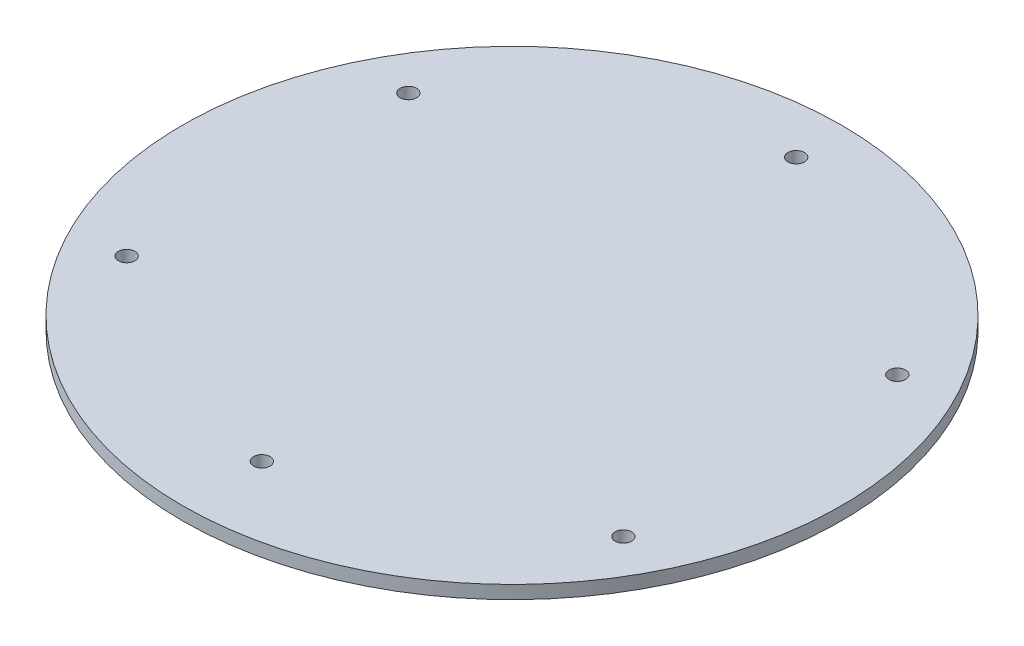
ISO-10303-21;
HEADER;
FILE_DESCRIPTION(('STEP AP214'),'2;1');
FILE_NAME('part.step','',(''),(''),'','','');
FILE_SCHEMA(('AUTOMOTIVE_DESIGN { 1 0 10303 214 1 1 1 1 }'));
ENDSEC;
DATA;
#1=APPLICATION_CONTEXT('core data for automotive mechanical design processes');
#2=APPLICATION_PROTOCOL_DEFINITION('international standard','automotive_design',2000,#1);
#3=PRODUCT_CONTEXT('',#1,'mechanical');
#4=PRODUCT('Part','Part','',(#3));
#5=PRODUCT_RELATED_PRODUCT_CATEGORY('part','',(#4));
#6=PRODUCT_DEFINITION_FORMATION('','',#4);
#7=PRODUCT_DEFINITION_CONTEXT('part definition',#1,'design');
#8=PRODUCT_DEFINITION('design','',#6,#7);
#9=PRODUCT_DEFINITION_SHAPE('','',#8);
#10=(LENGTH_UNIT() NAMED_UNIT(*) SI_UNIT(.MILLI.,.METRE.));
#11=(NAMED_UNIT(*) PLANE_ANGLE_UNIT() SI_UNIT($,.RADIAN.));
#12=(NAMED_UNIT(*) SI_UNIT($,.STERADIAN.) SOLID_ANGLE_UNIT());
#13=UNCERTAINTY_MEASURE_WITH_UNIT(LENGTH_MEASURE(1.E-05),#10,'distance_accuracy_value','');
#14=(GEOMETRIC_REPRESENTATION_CONTEXT(3) GLOBAL_UNCERTAINTY_ASSIGNED_CONTEXT((#13)) GLOBAL_UNIT_ASSIGNED_CONTEXT((#10,
#11,#12)) REPRESENTATION_CONTEXT('',''));
#15=CARTESIAN_POINT('',(0.,0.,0.));
#16=DIRECTION('',(0.,0.,1.));
#17=DIRECTION('',(1.,0.,0.));
#18=AXIS2_PLACEMENT_3D('',#15,#16,#17);
#19=CARTESIAN_POINT('',(1.9537450703172,2.,0.641277234321879));
#20=DIRECTION('',(0.,1.,0.));
#21=DIRECTION('',(0.,0.,1.));
#22=AXIS2_PLACEMENT_3D('',#19,#20,#21);
#23=PLANE('',#22);
#24=CARTESIAN_POINT('',(2.15334480760456,2.,38.7931650621697));
#25=DIRECTION('',(0.,1.,0.));
#26=DIRECTION('',(0.,0.,1.));
#27=AXIS2_PLACEMENT_3D('',#24,#25,#26);
#28=CIRCLE('',#27,1.25);
#29=CARTESIAN_POINT('',(2.15334480760456,2.,40.0431650621697));
#30=VERTEX_POINT('',#29);
#31=EDGE_CURVE('E69',#30,#30,#28,.T.);
#32=ORIENTED_EDGE('',*,*,#31,.F.);
#33=EDGE_LOOP('',(#32));
#34=FACE_BOUND('',#33,.T.);
#35=CARTESIAN_POINT('',(38.9808099361509,2.,-20.7950066515646));
#36=DIRECTION('',(0.,1.,0.));
#37=DIRECTION('',(0.,0.,1.));
#38=AXIS2_PLACEMENT_3D('',#35,#36,#37);
#39=CIRCLE('',#38,1.25);
#40=CARTESIAN_POINT('',(38.9808099361509,2.,-19.5450066515646));
#41=VERTEX_POINT('',#40);
#42=EDGE_CURVE('E57',#41,#41,#39,.T.);
#43=ORIENTED_EDGE('',*,*,#42,.F.);
#44=EDGE_LOOP('',(#43));
#45=FACE_BOUND('',#44,.T.);
#46=CARTESIAN_POINT('',(-35.1241537705123,2.,-20.7069596241211));
#47=DIRECTION('',(0.,1.,0.));
#48=DIRECTION('',(0.,0.,1.));
#49=AXIS2_PLACEMENT_3D('',#46,#47,#48);
#50=CIRCLE('',#49,1.25);
#51=CARTESIAN_POINT('',(-35.1241537705123,2.,-19.4569596241211));
#52=VERTEX_POINT('',#51);
#53=EDGE_CURVE('E46',#52,#52,#50,.T.);
#54=ORIENTED_EDGE('',*,*,#53,.F.);
#55=EDGE_LOOP('',(#54));
#56=FACE_BOUND('',#55,.T.);
#57=CARTESIAN_POINT('',(1.9537450703172,2.,0.641277234321879));
#58=DIRECTION('',(0.,1.,0.));
#59=DIRECTION('',(0.,0.,1.));
#60=AXIS2_PLACEMENT_3D('',#57,#58,#59);
#61=CIRCLE('',#60,50.);
#62=CARTESIAN_POINT('',(1.9537450703172,2.,50.6412772343219));
#63=VERTEX_POINT('',#62);
#64=EDGE_CURVE('E10',#63,#63,#61,.T.);
#65=ORIENTED_EDGE('',*,*,#64,.T.);
#66=EDGE_LOOP('',(#65));
#67=FACE_BOUND('',#66,.T.);
#68=CARTESIAN_POINT('',(2.72948539176649,2.,-41.6945479177622));
#69=DIRECTION('',(0.,1.,0.));
#70=DIRECTION('',(0.,0.,1.));
#71=AXIS2_PLACEMENT_3D('',#68,#69,#70);
#72=CIRCLE('',#71,1.25);
#73=CARTESIAN_POINT('',(2.72948539176649,2.,-40.4445479177622));
#74=VERTEX_POINT('',#73);
#75=EDGE_CURVE('E51',#74,#74,#72,.T.);
#76=ORIENTED_EDGE('',*,*,#75,.F.);
#77=EDGE_LOOP('',(#76));
#78=FACE_BOUND('',#77,.T.);
#79=CARTESIAN_POINT('',(39.4592156194108,2.,21.2469019205589));
#80=DIRECTION('',(0.,1.,0.));
#81=DIRECTION('',(0.,0.,1.));
#82=AXIS2_PLACEMENT_3D('',#79,#80,#81);
#83=CIRCLE('',#82,1.25);
#84=CARTESIAN_POINT('',(39.4592156194108,2.,22.4969019205589));
#85=VERTEX_POINT('',#84);
#86=EDGE_CURVE('E63',#85,#85,#83,.T.);
#87=ORIENTED_EDGE('',*,*,#86,.F.);
#88=EDGE_LOOP('',(#87));
#89=FACE_BOUND('',#88,.T.);
#90=CARTESIAN_POINT('',(-35.0733197955164,2.,22.0775611202083));
#91=DIRECTION('',(0.,1.,0.));
#92=DIRECTION('',(0.,0.,1.));
#93=AXIS2_PLACEMENT_3D('',#90,#91,#92);
#94=CIRCLE('',#93,1.25);
#95=CARTESIAN_POINT('',(-35.0733197955164,2.,23.3275611202083));
#96=VERTEX_POINT('',#95);
#97=EDGE_CURVE('E75',#96,#96,#94,.T.);
#98=ORIENTED_EDGE('',*,*,#97,.F.);
#99=EDGE_LOOP('',(#98));
#100=FACE_BOUND('',#99,.T.);
#101=ADVANCED_FACE('F35',(#34,#45,#56,#67,#78,#89,#100),#23,.T.);
#102=CARTESIAN_POINT('',(1.9537450703172,0.,0.641277234321879));
#103=DIRECTION('',(0.,1.,0.));
#104=DIRECTION('',(0.,0.,1.));
#105=AXIS2_PLACEMENT_3D('',#102,#103,#104);
#106=PLANE('',#105);
#107=CARTESIAN_POINT('',(1.9537450703172,0.,0.641277234321879));
#108=DIRECTION('',(0.,1.,0.));
#109=DIRECTION('',(0.,0.,1.));
#110=AXIS2_PLACEMENT_3D('',#107,#108,#109);
#111=CIRCLE('',#110,50.);
#112=CARTESIAN_POINT('',(1.9537450703172,0.,50.6412772343219));
#113=VERTEX_POINT('',#112);
#114=EDGE_CURVE('E39',#113,#113,#111,.T.);
#115=ORIENTED_EDGE('',*,*,#114,.F.);
#116=EDGE_LOOP('',(#115));
#117=FACE_BOUND('',#116,.T.);
#118=CARTESIAN_POINT('',(-35.1241537705123,0.,-20.7069596241211));
#119=DIRECTION('',(0.,1.,0.));
#120=DIRECTION('',(0.,0.,1.));
#121=AXIS2_PLACEMENT_3D('',#118,#119,#120);
#122=CIRCLE('',#121,1.25);
#123=CARTESIAN_POINT('',(-35.1241537705123,0.,-19.4569596241211));
#124=VERTEX_POINT('',#123);
#125=EDGE_CURVE('E48',#124,#124,#122,.T.);
#126=ORIENTED_EDGE('',*,*,#125,.T.);
#127=EDGE_LOOP('',(#126));
#128=FACE_BOUND('',#127,.T.);
#129=CARTESIAN_POINT('',(2.72948539176649,0.,-41.6945479177622));
#130=DIRECTION('',(0.,1.,0.));
#131=DIRECTION('',(0.,0.,1.));
#132=AXIS2_PLACEMENT_3D('',#129,#130,#131);
#133=CIRCLE('',#132,1.25);
#134=CARTESIAN_POINT('',(2.72948539176649,0.,-40.4445479177622));
#135=VERTEX_POINT('',#134);
#136=EDGE_CURVE('E54',#135,#135,#133,.T.);
#137=ORIENTED_EDGE('',*,*,#136,.T.);
#138=EDGE_LOOP('',(#137));
#139=FACE_BOUND('',#138,.T.);
#140=CARTESIAN_POINT('',(38.9808099361509,0.,-20.7950066515646));
#141=DIRECTION('',(0.,1.,0.));
#142=DIRECTION('',(0.,0.,1.));
#143=AXIS2_PLACEMENT_3D('',#140,#141,#142);
#144=CIRCLE('',#143,1.25);
#145=CARTESIAN_POINT('',(38.9808099361509,0.,-19.5450066515646));
#146=VERTEX_POINT('',#145);
#147=EDGE_CURVE('E60',#146,#146,#144,.T.);
#148=ORIENTED_EDGE('',*,*,#147,.T.);
#149=EDGE_LOOP('',(#148));
#150=FACE_BOUND('',#149,.T.);
#151=CARTESIAN_POINT('',(39.4592156194108,0.,21.2469019205589));
#152=DIRECTION('',(0.,1.,0.));
#153=DIRECTION('',(0.,0.,1.));
#154=AXIS2_PLACEMENT_3D('',#151,#152,#153);
#155=CIRCLE('',#154,1.25);
#156=CARTESIAN_POINT('',(39.4592156194108,0.,22.4969019205589));
#157=VERTEX_POINT('',#156);
#158=EDGE_CURVE('E66',#157,#157,#155,.T.);
#159=ORIENTED_EDGE('',*,*,#158,.T.);
#160=EDGE_LOOP('',(#159));
#161=FACE_BOUND('',#160,.T.);
#162=CARTESIAN_POINT('',(2.15334480760456,0.,38.7931650621697));
#163=DIRECTION('',(0.,1.,0.));
#164=DIRECTION('',(0.,0.,1.));
#165=AXIS2_PLACEMENT_3D('',#162,#163,#164);
#166=CIRCLE('',#165,1.25);
#167=CARTESIAN_POINT('',(2.15334480760456,0.,40.0431650621697));
#168=VERTEX_POINT('',#167);
#169=EDGE_CURVE('E72',#168,#168,#166,.T.);
#170=ORIENTED_EDGE('',*,*,#169,.T.);
#171=EDGE_LOOP('',(#170));
#172=FACE_BOUND('',#171,.T.);
#173=CARTESIAN_POINT('',(-35.0733197955164,0.,22.0775611202083));
#174=DIRECTION('',(0.,1.,0.));
#175=DIRECTION('',(0.,0.,1.));
#176=AXIS2_PLACEMENT_3D('',#173,#174,#175);
#177=CIRCLE('',#176,1.25);
#178=CARTESIAN_POINT('',(-35.0733197955164,0.,23.3275611202083));
#179=VERTEX_POINT('',#178);
#180=EDGE_CURVE('E78',#179,#179,#177,.T.);
#181=ORIENTED_EDGE('',*,*,#180,.T.);
#182=EDGE_LOOP('',(#181));
#183=FACE_BOUND('',#182,.T.);
#184=ADVANCED_FACE('F88',(#117,#128,#139,#150,#161,#172,#183),#106,.F.);
#185=CARTESIAN_POINT('',(1.9537450703172,2.,0.641277234321879));
#186=DIRECTION('',(0.,-1.,0.));
#187=DIRECTION('',(0.,0.,-1.));
#188=AXIS2_PLACEMENT_3D('',#185,#186,#187);
#189=CYLINDRICAL_SURFACE('',#188,50.);
#190=ORIENTED_EDGE('',*,*,#64,.F.);
#191=EDGE_LOOP('',(#190));
#192=FACE_BOUND('',#191,.T.);
#193=ORIENTED_EDGE('',*,*,#114,.T.);
#194=EDGE_LOOP('',(#193));
#195=FACE_BOUND('',#194,.T.);
#196=ADVANCED_FACE('F37',(#192,#195),#189,.T.);
#197=CARTESIAN_POINT('',(-35.1241537705123,2.,-20.7069596241211));
#198=DIRECTION('',(0.,-1.,0.));
#199=DIRECTION('',(0.,0.,-1.));
#200=AXIS2_PLACEMENT_3D('',#197,#198,#199);
#201=CYLINDRICAL_SURFACE('',#200,1.25);
#202=ORIENTED_EDGE('',*,*,#53,.T.);
#203=EDGE_LOOP('',(#202));
#204=FACE_BOUND('',#203,.T.);
#205=ORIENTED_EDGE('',*,*,#125,.F.);
#206=EDGE_LOOP('',(#205));
#207=FACE_BOUND('',#206,.T.);
#208=ADVANCED_FACE('F98',(#204,#207),#201,.F.);
#209=CARTESIAN_POINT('',(2.72948539176649,2.,-41.6945479177622));
#210=DIRECTION('',(0.,-1.,0.));
#211=DIRECTION('',(0.,0.,-1.));
#212=AXIS2_PLACEMENT_3D('',#209,#210,#211);
#213=CYLINDRICAL_SURFACE('',#212,1.25);
#214=ORIENTED_EDGE('',*,*,#75,.T.);
#215=EDGE_LOOP('',(#214));
#216=FACE_BOUND('',#215,.T.);
#217=ORIENTED_EDGE('',*,*,#136,.F.);
#218=EDGE_LOOP('',(#217));
#219=FACE_BOUND('',#218,.T.);
#220=ADVANCED_FACE('F101',(#216,#219),#213,.F.);
#221=CARTESIAN_POINT('',(38.9808099361509,2.,-20.7950066515646));
#222=DIRECTION('',(0.,-1.,0.));
#223=DIRECTION('',(0.,0.,-1.));
#224=AXIS2_PLACEMENT_3D('',#221,#222,#223);
#225=CYLINDRICAL_SURFACE('',#224,1.25);
#226=ORIENTED_EDGE('',*,*,#42,.T.);
#227=EDGE_LOOP('',(#226));
#228=FACE_BOUND('',#227,.T.);
#229=ORIENTED_EDGE('',*,*,#147,.F.);
#230=EDGE_LOOP('',(#229));
#231=FACE_BOUND('',#230,.T.);
#232=ADVANCED_FACE('F105',(#228,#231),#225,.F.);
#233=CARTESIAN_POINT('',(39.4592156194108,2.,21.2469019205589));
#234=DIRECTION('',(0.,-1.,0.));
#235=DIRECTION('',(0.,0.,-1.));
#236=AXIS2_PLACEMENT_3D('',#233,#234,#235);
#237=CYLINDRICAL_SURFACE('',#236,1.25);
#238=ORIENTED_EDGE('',*,*,#86,.T.);
#239=EDGE_LOOP('',(#238));
#240=FACE_BOUND('',#239,.T.);
#241=ORIENTED_EDGE('',*,*,#158,.F.);
#242=EDGE_LOOP('',(#241));
#243=FACE_BOUND('',#242,.T.);
#244=ADVANCED_FACE('F109',(#240,#243),#237,.F.);
#245=CARTESIAN_POINT('',(2.15334480760456,2.,38.7931650621697));
#246=DIRECTION('',(0.,-1.,0.));
#247=DIRECTION('',(0.,0.,-1.));
#248=AXIS2_PLACEMENT_3D('',#245,#246,#247);
#249=CYLINDRICAL_SURFACE('',#248,1.25);
#250=ORIENTED_EDGE('',*,*,#31,.T.);
#251=EDGE_LOOP('',(#250));
#252=FACE_BOUND('',#251,.T.);
#253=ORIENTED_EDGE('',*,*,#169,.F.);
#254=EDGE_LOOP('',(#253));
#255=FACE_BOUND('',#254,.T.);
#256=ADVANCED_FACE('F113',(#252,#255),#249,.F.);
#257=CARTESIAN_POINT('',(-35.0733197955164,2.,22.0775611202083));
#258=DIRECTION('',(0.,-1.,0.));
#259=DIRECTION('',(0.,0.,-1.));
#260=AXIS2_PLACEMENT_3D('',#257,#258,#259);
#261=CYLINDRICAL_SURFACE('',#260,1.25);
#262=ORIENTED_EDGE('',*,*,#97,.T.);
#263=EDGE_LOOP('',(#262));
#264=FACE_BOUND('',#263,.T.);
#265=ORIENTED_EDGE('',*,*,#180,.F.);
#266=EDGE_LOOP('',(#265));
#267=FACE_BOUND('',#266,.T.);
#268=ADVANCED_FACE('F84',(#264,#267),#261,.F.);
#269=CLOSED_SHELL('',(#101,#184,#196,#208,#220,#232,#244,#256,#268));
#270=MANIFOLD_SOLID_BREP('B2',#269);
#271=ADVANCED_BREP_SHAPE_REPRESENTATION('',(#18,#270),#14);
#272=SHAPE_DEFINITION_REPRESENTATION(#9,#271);
ENDSEC;
END-ISO-10303-21;
